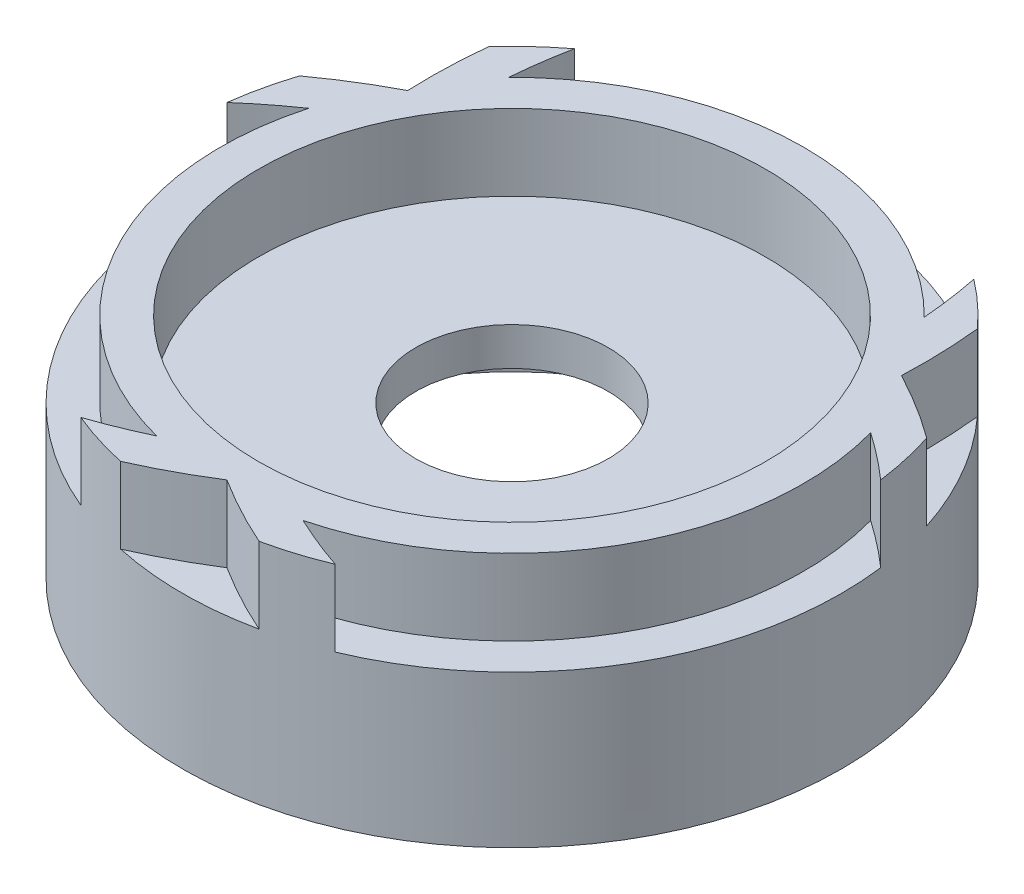
ISO-10303-21;
HEADER;
FILE_DESCRIPTION(('STEP AP214'),'2;1');
FILE_NAME('part.step','',(''),(''),'','','');
FILE_SCHEMA(('AUTOMOTIVE_DESIGN { 1 0 10303 214 1 1 1 1 }'));
ENDSEC;
DATA;
#1=APPLICATION_CONTEXT('core data for automotive mechanical design processes');
#2=APPLICATION_PROTOCOL_DEFINITION('international standard','automotive_design',2000,#1);
#3=PRODUCT_CONTEXT('',#1,'mechanical');
#4=PRODUCT('Part','Part','',(#3));
#5=PRODUCT_RELATED_PRODUCT_CATEGORY('part','',(#4));
#6=PRODUCT_DEFINITION_FORMATION('','',#4);
#7=PRODUCT_DEFINITION_CONTEXT('part definition',#1,'design');
#8=PRODUCT_DEFINITION('design','',#6,#7);
#9=PRODUCT_DEFINITION_SHAPE('','',#8);
#10=(LENGTH_UNIT() NAMED_UNIT(*) SI_UNIT(.MILLI.,.METRE.));
#11=(NAMED_UNIT(*) PLANE_ANGLE_UNIT() SI_UNIT($,.RADIAN.));
#12=(NAMED_UNIT(*) SI_UNIT($,.STERADIAN.) SOLID_ANGLE_UNIT());
#13=UNCERTAINTY_MEASURE_WITH_UNIT(LENGTH_MEASURE(1.E-05),#10,'distance_accuracy_value','');
#14=(GEOMETRIC_REPRESENTATION_CONTEXT(3) GLOBAL_UNCERTAINTY_ASSIGNED_CONTEXT((#13)) GLOBAL_UNIT_ASSIGNED_CONTEXT((#10,
#11,#12)) REPRESENTATION_CONTEXT('',''));
#15=CARTESIAN_POINT('',(0.,0.,0.));
#16=DIRECTION('',(0.,0.,1.));
#17=DIRECTION('',(1.,0.,0.));
#18=AXIS2_PLACEMENT_3D('',#15,#16,#17);
#19=CARTESIAN_POINT('',(0.,-3.,0.));
#20=DIRECTION('',(0.,-1.,0.));
#21=DIRECTION('',(0.,0.,-1.));
#22=AXIS2_PLACEMENT_3D('',#19,#20,#21);
#23=PLANE('',#22);
#24=CARTESIAN_POINT('',(0.,-3.,-63.0940107675848));
#25=DIRECTION('',(0.,-1.,0.));
#26=DIRECTION('',(0.,0.,-1.));
#27=AXIS2_PLACEMENT_3D('',#24,#25,#26);
#28=CIRCLE('',#27,10.);
#29=CARTESIAN_POINT('',(0.,-3.,-73.0940107675848));
#30=VERTEX_POINT('',#29);
#31=EDGE_CURVE('E326',#30,#30,#28,.T.);
#32=ORIENTED_EDGE('',*,*,#31,.F.);
#33=EDGE_LOOP('',(#32));
#34=FACE_BOUND('',#33,.T.);
#35=CARTESIAN_POINT('',(0.,-3.,-63.0940107675848));
#36=DIRECTION('',(0.,-1.,0.));
#37=DIRECTION('',(0.,0.,-1.));
#38=AXIS2_PLACEMENT_3D('',#35,#36,#37);
#39=CIRCLE('',#38,13.);
#40=CARTESIAN_POINT('',(0.,-3.,-76.0940107675848));
#41=VERTEX_POINT('',#40);
#42=EDGE_CURVE('E51',#41,#41,#39,.F.);
#43=ORIENTED_EDGE('',*,*,#42,.F.);
#44=EDGE_LOOP('',(#43));
#45=FACE_BOUND('',#44,.T.);
#46=ADVANCED_FACE('F47',(#34,#45),#23,.T.);
#47=CARTESIAN_POINT('',(0.,-10.7480230740358,-63.0940107675848));
#48=DIRECTION('',(0.,1.,0.));
#49=DIRECTION('',(0.,0.,1.));
#50=AXIS2_PLACEMENT_3D('',#47,#48,#49);
#51=CYLINDRICAL_SURFACE('',#50,3.80000000000009);
#52=CARTESIAN_POINT('',(0.,3.,-63.0940107675848));
#53=DIRECTION('',(0.,1.,0.));
#54=DIRECTION('',(0.,0.,1.));
#55=AXIS2_PLACEMENT_3D('',#52,#53,#54);
#56=CIRCLE('',#55,3.80000000000009);
#57=CARTESIAN_POINT('',(0.,3.,-59.2940107675847));
#58=VERTEX_POINT('',#57);
#59=EDGE_CURVE('E321',#58,#58,#56,.T.);
#60=CARTESIAN_POINT('',(0.,1.5,-63.0940107675848));
#61=DIRECTION('',(0.,-1.,0.));
#62=DIRECTION('',(0.,0.,-1.));
#63=AXIS2_PLACEMENT_3D('',#60,#61,#62);
#64=CIRCLE('',#63,3.80000000000009);
#65=CARTESIAN_POINT('',(0.,1.5,-59.2940107675847));
#66=VERTEX_POINT('',#65);
#67=EDGE_CURVE('E323',#66,#66,#64,.F.);
#68=CARTESIAN_POINT('',(0.,3.,-59.2940107675847));
#69=CARTESIAN_POINT('',(0.,2.984375,-59.2940107675847));
#70=CARTESIAN_POINT('',(0.,2.96875,-59.2940107675847));
#71=CARTESIAN_POINT('',(0.,2.9375,-59.2940107675847));
#72=CARTESIAN_POINT('',(0.,2.921875,-59.2940107675847));
#73=CARTESIAN_POINT('',(0.,2.890625,-59.2940107675847));
#74=CARTESIAN_POINT('',(0.,2.875,-59.2940107675847));
#75=CARTESIAN_POINT('',(0.,2.84375,-59.2940107675847));
#76=CARTESIAN_POINT('',(0.,2.828125,-59.2940107675847));
#77=CARTESIAN_POINT('',(0.,2.796875,-59.2940107675847));
#78=CARTESIAN_POINT('',(0.,2.78125,-59.2940107675847));
#79=CARTESIAN_POINT('',(0.,2.75,-59.2940107675847));
#80=CARTESIAN_POINT('',(0.,2.734375,-59.2940107675847));
#81=CARTESIAN_POINT('',(0.,2.703125,-59.2940107675847));
#82=CARTESIAN_POINT('',(0.,2.6875,-59.2940107675847));
#83=CARTESIAN_POINT('',(0.,2.65625,-59.2940107675847));
#84=CARTESIAN_POINT('',(0.,2.640625,-59.2940107675847));
#85=CARTESIAN_POINT('',(0.,2.609375,-59.2940107675847));
#86=CARTESIAN_POINT('',(0.,2.59375,-59.2940107675847));
#87=CARTESIAN_POINT('',(0.,2.5625,-59.2940107675847));
#88=CARTESIAN_POINT('',(0.,2.546875,-59.2940107675847));
#89=CARTESIAN_POINT('',(0.,2.515625,-59.2940107675847));
#90=CARTESIAN_POINT('',(0.,2.5,-59.2940107675847));
#91=CARTESIAN_POINT('',(0.,2.46875,-59.2940107675847));
#92=CARTESIAN_POINT('',(0.,2.453125,-59.2940107675847));
#93=CARTESIAN_POINT('',(0.,2.421875,-59.2940107675847));
#94=CARTESIAN_POINT('',(0.,2.40625,-59.2940107675847));
#95=CARTESIAN_POINT('',(0.,2.375,-59.2940107675847));
#96=CARTESIAN_POINT('',(0.,2.359375,-59.2940107675847));
#97=CARTESIAN_POINT('',(0.,2.328125,-59.2940107675847));
#98=CARTESIAN_POINT('',(0.,2.3125,-59.2940107675847));
#99=CARTESIAN_POINT('',(0.,2.28125,-59.2940107675847));
#100=CARTESIAN_POINT('',(0.,2.265625,-59.2940107675847));
#101=CARTESIAN_POINT('',(0.,2.234375,-59.2940107675847));
#102=CARTESIAN_POINT('',(0.,2.21875,-59.2940107675847));
#103=CARTESIAN_POINT('',(0.,2.1875,-59.2940107675847));
#104=CARTESIAN_POINT('',(0.,2.171875,-59.2940107675847));
#105=CARTESIAN_POINT('',(0.,2.140625,-59.2940107675847));
#106=CARTESIAN_POINT('',(0.,2.125,-59.2940107675847));
#107=CARTESIAN_POINT('',(0.,2.09375,-59.2940107675847));
#108=CARTESIAN_POINT('',(0.,2.078125,-59.2940107675847));
#109=CARTESIAN_POINT('',(0.,2.046875,-59.2940107675847));
#110=CARTESIAN_POINT('',(0.,2.03125,-59.2940107675847));
#111=CARTESIAN_POINT('',(0.,2.,-59.2940107675847));
#112=CARTESIAN_POINT('',(0.,1.984375,-59.2940107675847));
#113=CARTESIAN_POINT('',(0.,1.953125,-59.2940107675847));
#114=CARTESIAN_POINT('',(0.,1.9375,-59.2940107675847));
#115=CARTESIAN_POINT('',(0.,1.90625,-59.2940107675847));
#116=CARTESIAN_POINT('',(0.,1.890625,-59.2940107675847));
#117=CARTESIAN_POINT('',(0.,1.859375,-59.2940107675847));
#118=CARTESIAN_POINT('',(0.,1.84375,-59.2940107675847));
#119=CARTESIAN_POINT('',(0.,1.8125,-59.2940107675847));
#120=CARTESIAN_POINT('',(0.,1.796875,-59.2940107675847));
#121=CARTESIAN_POINT('',(0.,1.765625,-59.2940107675847));
#122=CARTESIAN_POINT('',(0.,1.75,-59.2940107675847));
#123=CARTESIAN_POINT('',(0.,1.71875,-59.2940107675847));
#124=CARTESIAN_POINT('',(0.,1.703125,-59.2940107675847));
#125=CARTESIAN_POINT('',(0.,1.671875,-59.2940107675847));
#126=CARTESIAN_POINT('',(0.,1.65625,-59.2940107675847));
#127=CARTESIAN_POINT('',(0.,1.625,-59.2940107675847));
#128=CARTESIAN_POINT('',(0.,1.609375,-59.2940107675847));
#129=CARTESIAN_POINT('',(0.,1.578125,-59.2940107675847));
#130=CARTESIAN_POINT('',(0.,1.5625,-59.2940107675847));
#131=CARTESIAN_POINT('',(0.,1.53125,-59.2940107675847));
#132=CARTESIAN_POINT('',(0.,1.515625,-59.2940107675847));
#133=CARTESIAN_POINT('',(0.,1.5,-59.2940107675847));
#134=B_SPLINE_CURVE_WITH_KNOTS('',3,(#68,#69,#70,#71,#72,#73,#74,#75,#76,#77,#78,#79,#80,#81,
#82,#83,#84,#85,#86,#87,#88,#89,#90,#91,#92,#93,#94,#95,#96,#97,#98,#99,#100,#101,#102,#103,
#104,#105,#106,#107,#108,#109,#110,#111,#112,#113,#114,#115,#116,#117,#118,#119,#120,#121,#122,
#123,#124,#125,#126,#127,#128,#129,#130,#131,#132,#133),.UNSPECIFIED.,.F.,.F.,(4,2,2,2,2,2,2,2,
2,2,2,2,2,2,2,2,2,2,2,2,2,2,2,2,2,2,2,2,2,2,2,2,4),(0.,0.046875,0.0937500000000001,0.140625,
0.1875,0.234375,0.28125,0.328125,0.375,0.421875,0.46875,0.515625,0.5625,0.609375000000001,
0.656250000000001,0.703125000000001,0.750000000000001,0.796875000000001,0.843750000000001,
0.890625000000001,0.937500000000001,0.984375000000001,1.03125,1.078125,1.125,1.171875,1.21875,
1.265625,1.3125,1.359375,1.40625,1.453125,1.5),.UNSPECIFIED.);
#135=EDGE_CURVE('BSEAM337',#58,#66,#134,.T.);
#136=ORIENTED_EDGE('',*,*,#59,.T.);
#137=ORIENTED_EDGE('',*,*,#67,.F.);
#138=ORIENTED_EDGE('',*,*,#135,.T.);
#139=ORIENTED_EDGE('',*,*,#135,.F.);
#140=EDGE_LOOP('',(#136,#138,#137,#139));
#141=FACE_BOUND('',#140,.T.);
#142=ADVANCED_FACE('F337',(#141),#51,.F.);
#143=CARTESIAN_POINT('',(0.,1.5,-63.0940107675848));
#144=DIRECTION('',(0.,-1.,0.));
#145=DIRECTION('',(0.,0.,-1.));
#146=AXIS2_PLACEMENT_3D('',#143,#144,#145);
#147=PLANE('',#146);
#148=CARTESIAN_POINT('',(0.,1.5,-63.0940107675848));
#149=DIRECTION('',(0.,-1.,0.));
#150=DIRECTION('',(0.,0.,-1.));
#151=AXIS2_PLACEMENT_3D('',#148,#149,#150);
#152=CIRCLE('',#151,6.30000000000009);
#153=CARTESIAN_POINT('',(0.,1.5,-69.3940107675849));
#154=VERTEX_POINT('',#153);
#155=EDGE_CURVE('E56',#154,#154,#152,.T.);
#156=ORIENTED_EDGE('',*,*,#155,.T.);
#157=EDGE_LOOP('',(#156));
#158=FACE_BOUND('',#157,.T.);
#159=ORIENTED_EDGE('',*,*,#67,.T.);
#160=EDGE_LOOP('',(#159));
#161=FACE_BOUND('',#160,.T.);
#162=ADVANCED_FACE('F343',(#158,#161),#147,.T.);
#163=CARTESIAN_POINT('',(0.,1.5,-63.0940107675848));
#164=DIRECTION('',(0.,-1.,0.));
#165=DIRECTION('',(0.,0.,-1.));
#166=AXIS2_PLACEMENT_3D('',#163,#164,#165);
#167=CYLINDRICAL_SURFACE('',#166,6.30000000000009);
#168=ORIENTED_EDGE('',*,*,#155,.F.);
#169=EDGE_LOOP('',(#168));
#170=FACE_BOUND('',#169,.T.);
#171=CARTESIAN_POINT('',(0.,0.,-63.0940107675848));
#172=DIRECTION('',(0.,-1.,0.));
#173=DIRECTION('',(0.,0.,-1.));
#174=AXIS2_PLACEMENT_3D('',#171,#172,#173);
#175=CIRCLE('',#174,6.30000000000009);
#176=CARTESIAN_POINT('',(0.,0.,-69.3940107675849));
#177=VERTEX_POINT('',#176);
#178=EDGE_CURVE('E11',#177,#177,#175,.T.);
#179=ORIENTED_EDGE('',*,*,#178,.T.);
#180=EDGE_LOOP('',(#179));
#181=FACE_BOUND('',#180,.T.);
#182=ADVANCED_FACE('F394',(#170,#181),#167,.F.);
#183=CARTESIAN_POINT('',(0.,0.,0.));
#184=DIRECTION('',(0.,1.,0.));
#185=DIRECTION('',(0.,0.,1.));
#186=AXIS2_PLACEMENT_3D('',#183,#184,#185);
#187=PLANE('',#186);
#188=ORIENTED_EDGE('',*,*,#178,.F.);
#189=EDGE_LOOP('',(#188));
#190=FACE_BOUND('',#189,.T.);
#191=CARTESIAN_POINT('',(0.,0.,-63.0940107675848));
#192=DIRECTION('',(0.,1.,0.));
#193=DIRECTION('',(0.,0.,1.));
#194=AXIS2_PLACEMENT_3D('',#191,#192,#193);
#195=CIRCLE('',#194,10.);
#196=CARTESIAN_POINT('',(0.,0.,-53.0940107675848));
#197=VERTEX_POINT('',#196);
#198=EDGE_CURVE('E264',#197,#197,#195,.F.);
#199=ORIENTED_EDGE('',*,*,#198,.T.);
#200=EDGE_LOOP('',(#199));
#201=FACE_BOUND('',#200,.T.);
#202=ADVANCED_FACE('F399',(#190,#201),#187,.F.);
#203=CARTESIAN_POINT('',(0.,-9.,-63.0940107675848));
#204=DIRECTION('',(0.,1.,0.));
#205=DIRECTION('',(0.,0.,1.));
#206=AXIS2_PLACEMENT_3D('',#203,#204,#205);
#207=CYLINDRICAL_SURFACE('',#206,10.);
#208=ORIENTED_EDGE('',*,*,#198,.F.);
#209=EDGE_LOOP('',(#208));
#210=FACE_BOUND('',#209,.T.);
#211=ORIENTED_EDGE('',*,*,#31,.T.);
#212=EDGE_LOOP('',(#211));
#213=FACE_BOUND('',#212,.T.);
#214=ADVANCED_FACE('F405',(#210,#213),#207,.F.);
#215=CARTESIAN_POINT('',(0.,3.,0.));
#216=DIRECTION('',(0.,1.,0.));
#217=DIRECTION('',(0.,0.,1.));
#218=AXIS2_PLACEMENT_3D('',#215,#216,#217);
#219=PLANE('',#218);
#220=ORIENTED_EDGE('',*,*,#59,.F.);
#221=EDGE_LOOP('',(#220));
#222=FACE_BOUND('',#221,.T.);
#223=CARTESIAN_POINT('',(0.,3.,-63.0940107675848));
#224=DIRECTION('',(0.,1.,0.));
#225=DIRECTION('',(0.,0.,1.));
#226=AXIS2_PLACEMENT_3D('',#223,#224,#225);
#227=CIRCLE('',#226,10.);
#228=CARTESIAN_POINT('',(0.,3.,-53.0940107675848));
#229=VERTEX_POINT('',#228);
#230=EDGE_CURVE('E285',#229,#229,#227,.T.);
#231=ORIENTED_EDGE('',*,*,#230,.T.);
#232=EDGE_LOOP('',(#231));
#233=FACE_BOUND('',#232,.T.);
#234=ADVANCED_FACE('F407',(#222,#233),#219,.T.);
#235=CARTESIAN_POINT('',(0.,6.,-63.0940107675848));
#236=DIRECTION('',(0.,-1.,0.));
#237=DIRECTION('',(0.,0.,-1.));
#238=AXIS2_PLACEMENT_3D('',#235,#236,#237);
#239=CYLINDRICAL_SURFACE('',#238,11.4999999999999);
#240=DIRECTION('',(0.,-1.,0.));
#241=VECTOR('',#240,1.);
#242=CARTESIAN_POINT('',(-2.88919192501458,4.5,-51.9628576368248));
#243=LINE('',#242,#241);
#244=CARTESIAN_POINT('',(-2.88919192501458,6.,-51.9628576368248));
#245=VERTEX_POINT('',#244);
#246=CARTESIAN_POINT('',(-2.88919192501458,3.,-51.9628576368248));
#247=VERTEX_POINT('',#246);
#248=EDGE_CURVE('E296',#245,#247,#243,.T.);
#249=ORIENTED_EDGE('',*,*,#248,.F.);
#250=CARTESIAN_POINT('',(0.,6.,-63.0940107675848));
#251=DIRECTION('',(0.,1.,0.));
#252=DIRECTION('',(0.,0.,1.));
#253=AXIS2_PLACEMENT_3D('',#250,#251,#252);
#254=CIRCLE('',#253,11.4999999999999);
#255=CARTESIAN_POINT('',(-11.0844573471601,6.,-66.1574737294938));
#256=VERTEX_POINT('',#255);
#257=EDGE_CURVE('E291',#256,#245,#254,.T.);
#258=ORIENTED_EDGE('',*,*,#257,.F.);
#259=DIRECTION('',(0.,-1.,0.));
#260=VECTOR('',#259,1.);
#261=CARTESIAN_POINT('',(-11.0844573471601,4.5,-66.1574737294938));
#262=LINE('',#261,#260);
#263=CARTESIAN_POINT('',(-11.0844573471601,3.,-66.1574737294938));
#264=VERTEX_POINT('',#263);
#265=EDGE_CURVE('E294',#264,#256,#262,.F.);
#266=ORIENTED_EDGE('',*,*,#265,.F.);
#267=CARTESIAN_POINT('',(0.,3.,-63.0940107675848));
#268=DIRECTION('',(0.,1.,0.));
#269=DIRECTION('',(0.,0.,1.));
#270=AXIS2_PLACEMENT_3D('',#267,#268,#269);
#271=CIRCLE('',#270,11.4999999999999);
#272=EDGE_CURVE('E214',#247,#264,#271,.F.);
#273=ORIENTED_EDGE('',*,*,#272,.F.);
#274=EDGE_LOOP('',(#249,#258,#266,#273));
#275=FACE_BOUND('',#274,.T.);
#276=ADVANCED_FACE('F410',(#275),#239,.T.);
#277=CARTESIAN_POINT('',(0.,6.,-63.0940107675848));
#278=DIRECTION('',(0.,-1.,0.));
#279=DIRECTION('',(0.,0.,-1.));
#280=AXIS2_PLACEMENT_3D('',#277,#278,#279);
#281=CYLINDRICAL_SURFACE('',#280,11.5000000000001);
#282=DIRECTION('',(0.,-1.,0.));
#283=VECTOR('',#282,1.);
#284=CARTESIAN_POINT('',(8.19526542214578,4.5,-71.1617009364363));
#285=LINE('',#284,#283);
#286=CARTESIAN_POINT('',(8.19526542214578,3.,-71.1617009364363));
#287=VERTEX_POINT('',#286);
#288=CARTESIAN_POINT('',(8.19526542214578,6.,-71.1617009364363));
#289=VERTEX_POINT('',#288);
#290=EDGE_CURVE('E302',#287,#289,#285,.F.);
#291=ORIENTED_EDGE('',*,*,#290,.F.);
#292=CARTESIAN_POINT('',(0.,3.,-63.0940107675848));
#293=DIRECTION('',(0.,1.,0.));
#294=DIRECTION('',(0.,0.,1.));
#295=AXIS2_PLACEMENT_3D('',#292,#293,#294);
#296=CIRCLE('',#295,11.5000000000001);
#297=CARTESIAN_POINT('',(-8.19526542214581,3.,-71.1617009364364));
#298=VERTEX_POINT('',#297);
#299=EDGE_CURVE('E314',#298,#287,#296,.F.);
#300=ORIENTED_EDGE('',*,*,#299,.F.);
#301=DIRECTION('',(0.,-1.,0.));
#302=VECTOR('',#301,1.);
#303=CARTESIAN_POINT('',(-8.19526542214581,4.5,-71.1617009364364));
#304=LINE('',#303,#302);
#305=CARTESIAN_POINT('',(-8.19526542214581,6.,-71.1617009364364));
#306=VERTEX_POINT('',#305);
#307=EDGE_CURVE('E299',#306,#298,#304,.T.);
#308=ORIENTED_EDGE('',*,*,#307,.F.);
#309=CARTESIAN_POINT('',(0.,6.,-63.0940107675848));
#310=DIRECTION('',(0.,1.,0.));
#311=DIRECTION('',(0.,0.,1.));
#312=AXIS2_PLACEMENT_3D('',#309,#310,#311);
#313=CIRCLE('',#312,11.5000000000001);
#314=EDGE_CURVE('E288',#289,#306,#313,.T.);
#315=ORIENTED_EDGE('',*,*,#314,.F.);
#316=EDGE_LOOP('',(#291,#300,#308,#315));
#317=FACE_BOUND('',#316,.T.);
#318=ADVANCED_FACE('F416',(#317),#281,.T.);
#319=CARTESIAN_POINT('',(0.,6.,-63.0940107675848));
#320=DIRECTION('',(0.,-1.,0.));
#321=DIRECTION('',(0.,0.,-1.));
#322=AXIS2_PLACEMENT_3D('',#319,#320,#321);
#323=CYLINDRICAL_SURFACE('',#322,11.5);
#324=DIRECTION('',(0.,-1.,0.));
#325=VECTOR('',#324,1.);
#326=CARTESIAN_POINT('',(2.88919192501457,4.5,-51.9628576368248));
#327=LINE('',#326,#325);
#328=CARTESIAN_POINT('',(2.88919192501457,3.,-51.9628576368248));
#329=VERTEX_POINT('',#328);
#330=CARTESIAN_POINT('',(2.88919192501458,6.,-51.9628576368248));
#331=VERTEX_POINT('',#330);
#332=EDGE_CURVE('E307',#329,#331,#327,.F.);
#333=ORIENTED_EDGE('',*,*,#332,.F.);
#334=CARTESIAN_POINT('',(0.,3.,-63.0940107675848));
#335=DIRECTION('',(0.,1.,0.));
#336=DIRECTION('',(0.,0.,1.));
#337=AXIS2_PLACEMENT_3D('',#334,#335,#336);
#338=CIRCLE('',#337,11.5);
#339=CARTESIAN_POINT('',(11.08445734716,3.,-66.1574737294939));
#340=VERTEX_POINT('',#339);
#341=EDGE_CURVE('E316',#340,#329,#338,.F.);
#342=ORIENTED_EDGE('',*,*,#341,.F.);
#343=DIRECTION('',(0.,-1.,0.));
#344=VECTOR('',#343,1.);
#345=CARTESIAN_POINT('',(11.08445734716,4.5,-66.1574737294939));
#346=LINE('',#345,#344);
#347=CARTESIAN_POINT('',(11.08445734716,6.,-66.1574737294939));
#348=VERTEX_POINT('',#347);
#349=EDGE_CURVE('E304',#348,#340,#346,.T.);
#350=ORIENTED_EDGE('',*,*,#349,.F.);
#351=CARTESIAN_POINT('',(0.,6.,-63.0940107675848));
#352=DIRECTION('',(0.,1.,0.));
#353=DIRECTION('',(0.,0.,1.));
#354=AXIS2_PLACEMENT_3D('',#351,#352,#353);
#355=CIRCLE('',#354,11.5);
#356=EDGE_CURVE('E284',#331,#348,#355,.T.);
#357=ORIENTED_EDGE('',*,*,#356,.F.);
#358=EDGE_LOOP('',(#333,#342,#350,#357));
#359=FACE_BOUND('',#358,.T.);
#360=ADVANCED_FACE('F412',(#359),#323,.T.);
#361=CARTESIAN_POINT('',(0.,6.,-63.0940107675848));
#362=DIRECTION('',(0.,-1.,0.));
#363=DIRECTION('',(0.,0.,-1.));
#364=AXIS2_PLACEMENT_3D('',#361,#362,#363);
#365=CYLINDRICAL_SURFACE('',#364,10.);
#366=ORIENTED_EDGE('',*,*,#230,.F.);
#367=EDGE_LOOP('',(#366));
#368=FACE_BOUND('',#367,.T.);
#369=CARTESIAN_POINT('',(0.,6.,-63.0940107675848));
#370=DIRECTION('',(0.,1.,0.));
#371=DIRECTION('',(0.,0.,1.));
#372=AXIS2_PLACEMENT_3D('',#369,#370,#371);
#373=CIRCLE('',#372,10.);
#374=CARTESIAN_POINT('',(0.,6.,-53.0940107675848));
#375=VERTEX_POINT('',#374);
#376=EDGE_CURVE('E281',#375,#375,#373,.T.);
#377=ORIENTED_EDGE('',*,*,#376,.T.);
#378=EDGE_LOOP('',(#377));
#379=FACE_BOUND('',#378,.T.);
#380=ADVANCED_FACE('F415',(#368,#379),#365,.F.);
#381=CARTESIAN_POINT('',(11.2583302491977,6.,-69.594010767585));
#382=DIRECTION('',(0.,-1.,0.));
#383=DIRECTION('',(0.,0.,-1.));
#384=AXIS2_PLACEMENT_3D('',#381,#382,#383);
#385=CYLINDRICAL_SURFACE('',#384,19.5166604983954);
#386=CARTESIAN_POINT('',(11.2583302491977,6.,-69.594010767585));
#387=DIRECTION('',(0.,1.,0.));
#388=DIRECTION('',(0.,0.,1.));
#389=AXIS2_PLACEMENT_3D('',#386,#387,#388);
#390=CIRCLE('',#389,19.5166604983954);
#391=CARTESIAN_POINT('',(5.01848841913951,6.,-51.1017310015453));
#392=VERTEX_POINT('',#391);
#393=EDGE_CURVE('E235',#331,#392,#390,.T.);
#394=ORIENTED_EDGE('',*,*,#393,.T.);
#395=DIRECTION('',(0.,1.,0.));
#396=VECTOR('',#395,1.);
#397=CARTESIAN_POINT('',(5.01848841913951,-3.005,-51.1017310015453));
#398=LINE('',#397,#396);
#399=CARTESIAN_POINT('',(5.01848841913951,3.,-51.1017310015453));
#400=VERTEX_POINT('',#399);
#401=EDGE_CURVE('E363',#392,#400,#398,.F.);
#402=ORIENTED_EDGE('',*,*,#401,.T.);
#403=CARTESIAN_POINT('',(11.2583302491977,3.,-69.594010767585));
#404=DIRECTION('',(0.,1.,0.));
#405=DIRECTION('',(0.,0.,1.));
#406=AXIS2_PLACEMENT_3D('',#403,#404,#405);
#407=CIRCLE('',#406,19.5166604983954);
#408=EDGE_CURVE('E242',#329,#400,#407,.T.);
#409=ORIENTED_EDGE('',*,*,#408,.F.);
#410=ORIENTED_EDGE('',*,*,#332,.T.);
#411=EDGE_LOOP('',(#394,#402,#409,#410));
#412=FACE_BOUND('',#411,.T.);
#413=ADVANCED_FACE('F426',(#412),#385,.F.);
#414=CARTESIAN_POINT('',(0.,3.,0.));
#415=DIRECTION('',(0.,1.,0.));
#416=DIRECTION('',(0.,0.,1.));
#417=AXIS2_PLACEMENT_3D('',#414,#415,#416);
#418=PLANE('',#417);
#419=ORIENTED_EDGE('',*,*,#408,.T.);
#420=CARTESIAN_POINT('',(0.,3.,-63.0940107675848));
#421=DIRECTION('',(0.,1.,0.));
#422=DIRECTION('',(0.,0.,1.));
#423=AXIS2_PLACEMENT_3D('',#420,#421,#422);
#424=CIRCLE('',#423,13.);
#425=CARTESIAN_POINT('',(12.89486313625,3.,-64.7440121910323));
#426=VERTEX_POINT('',#425);
#427=EDGE_CURVE('E318',#400,#426,#424,.T.);
#428=ORIENTED_EDGE('',*,*,#427,.T.);
#429=CARTESIAN_POINT('',(0.,3.,-50.094010767585));
#430=DIRECTION('',(0.,1.,0.));
#431=DIRECTION('',(0.,0.,1.));
#432=AXIS2_PLACEMENT_3D('',#429,#430,#431);
#433=CIRCLE('',#432,19.5166604983954);
#434=EDGE_CURVE('E239',#426,#340,#433,.T.);
#435=ORIENTED_EDGE('',*,*,#434,.T.);
#436=ORIENTED_EDGE('',*,*,#341,.T.);
#437=EDGE_LOOP('',(#419,#428,#435,#436));
#438=FACE_BOUND('',#437,.T.);
#439=ADVANCED_FACE('F448',(#438),#418,.T.);
#440=CARTESIAN_POINT('',(0.,6.,-50.094010767585));
#441=DIRECTION('',(0.,-1.,0.));
#442=DIRECTION('',(0.,0.,-1.));
#443=AXIS2_PLACEMENT_3D('',#440,#441,#442);
#444=CYLINDRICAL_SURFACE('',#443,19.5166604983954);
#445=ORIENTED_EDGE('',*,*,#434,.F.);
#446=DIRECTION('',(0.,1.,0.));
#447=VECTOR('',#446,1.);
#448=CARTESIAN_POINT('',(12.89486313625,-3.005,-64.7440121910323));
#449=LINE('',#448,#447);
#450=CARTESIAN_POINT('',(12.89486313625,6.,-64.7440121910323));
#451=VERTEX_POINT('',#450);
#452=EDGE_CURVE('E272',#426,#451,#449,.T.);
#453=ORIENTED_EDGE('',*,*,#452,.T.);
#454=CARTESIAN_POINT('',(0.,6.,-50.094010767585));
#455=DIRECTION('',(0.,1.,0.));
#456=DIRECTION('',(0.,0.,1.));
#457=AXIS2_PLACEMENT_3D('',#454,#455,#456);
#458=CIRCLE('',#457,19.5166604983954);
#459=EDGE_CURVE('E232',#451,#348,#458,.T.);
#460=ORIENTED_EDGE('',*,*,#459,.T.);
#461=ORIENTED_EDGE('',*,*,#349,.T.);
#462=EDGE_LOOP('',(#445,#453,#460,#461));
#463=FACE_BOUND('',#462,.T.);
#464=ADVANCED_FACE('F450',(#463),#444,.F.);
#465=CARTESIAN_POINT('',(0.,6.,-50.094010767585));
#466=DIRECTION('',(0.,-1.,0.));
#467=DIRECTION('',(0.,0.,-1.));
#468=AXIS2_PLACEMENT_3D('',#465,#466,#467);
#469=CYLINDRICAL_SURFACE('',#468,21.0166604983954);
#470=DIRECTION('',(0.,1.,0.));
#471=VECTOR('',#470,1.);
#472=CARTESIAN_POINT('',(12.373042022027,-3.005,-67.0824730177702));
#473=LINE('',#472,#471);
#474=CARTESIAN_POINT('',(12.373042022027,3.,-67.0824730177702));
#475=VERTEX_POINT('',#474);
#476=CARTESIAN_POINT('',(12.373042022027,6.,-67.0824730177702));
#477=VERTEX_POINT('',#476);
#478=EDGE_CURVE('E268',#475,#477,#473,.T.);
#479=ORIENTED_EDGE('',*,*,#478,.F.);
#480=CARTESIAN_POINT('',(0.,3.,-50.094010767585));
#481=DIRECTION('',(0.,1.,0.));
#482=DIRECTION('',(0.,0.,1.));
#483=AXIS2_PLACEMENT_3D('',#480,#481,#482);
#484=CIRCLE('',#483,21.0166604983954);
#485=CARTESIAN_POINT('',(9.74004155234482,3.,-68.7174263797495));
#486=VERTEX_POINT('',#485);
#487=EDGE_CURVE('E227',#475,#486,#484,.T.);
#488=ORIENTED_EDGE('',*,*,#487,.T.);
#489=DIRECTION('',(0.,-1.,0.));
#490=VECTOR('',#489,1.);
#491=CARTESIAN_POINT('',(9.74004155234482,6.,-68.7174263797495));
#492=LINE('',#491,#490);
#493=CARTESIAN_POINT('',(9.74004155234482,6.,-68.7174263797495));
#494=VERTEX_POINT('',#493);
#495=EDGE_CURVE('E215',#494,#486,#492,.T.);
#496=ORIENTED_EDGE('',*,*,#495,.F.);
#497=CARTESIAN_POINT('',(0.,6.,-50.094010767585));
#498=DIRECTION('',(0.,1.,0.));
#499=DIRECTION('',(0.,0.,1.));
#500=AXIS2_PLACEMENT_3D('',#497,#498,#499);
#501=CIRCLE('',#500,21.0166604983954);
#502=EDGE_CURVE('E221',#477,#494,#501,.T.);
#503=ORIENTED_EDGE('',*,*,#502,.F.);
#504=EDGE_LOOP('',(#479,#488,#496,#503));
#505=FACE_BOUND('',#504,.T.);
#506=ADVANCED_FACE('F452',(#505),#469,.T.);
#507=ORIENTED_EDGE('',*,*,#487,.F.);
#508=CARTESIAN_POINT('',(0.,3.,-63.0940107675848));
#509=DIRECTION('',(0.,1.,0.));
#510=DIRECTION('',(0.,0.,1.));
#511=AXIS2_PLACEMENT_3D('',#508,#509,#510);
#512=CIRCLE('',#511,13.);
#513=CARTESIAN_POINT('',(9.64063064170913,3.,-71.81514835566));
#514=VERTEX_POINT('',#513);
#515=EDGE_CURVE('E280',#475,#514,#512,.T.);
#516=ORIENTED_EDGE('',*,*,#515,.T.);
#517=CARTESIAN_POINT('',(-11.2583302491977,3.,-69.594010767585));
#518=DIRECTION('',(0.,1.,0.));
#519=DIRECTION('',(0.,0.,1.));
#520=AXIS2_PLACEMENT_3D('',#517,#518,#519);
#521=CIRCLE('',#520,21.0166604983954);
#522=EDGE_CURVE('E229',#486,#514,#521,.T.);
#523=ORIENTED_EDGE('',*,*,#522,.F.);
#524=EDGE_LOOP('',(#507,#516,#523));
#525=FACE_BOUND('',#524,.T.);
#526=ADVANCED_FACE('F441',(#525),#418,.T.);
#527=CARTESIAN_POINT('',(-11.2583302491977,6.,-69.594010767585));
#528=DIRECTION('',(0.,-1.,0.));
#529=DIRECTION('',(0.,0.,-1.));
#530=AXIS2_PLACEMENT_3D('',#527,#528,#529);
#531=CYLINDRICAL_SURFACE('',#530,21.0166604983954);
#532=DIRECTION('',(0.,1.,0.));
#533=VECTOR('',#532,1.);
#534=CARTESIAN_POINT('',(9.64063064170914,-3.005,-71.81514835566));
#535=LINE('',#534,#533);
#536=CARTESIAN_POINT('',(9.64063064170913,6.,-71.81514835566));
#537=VERTEX_POINT('',#536);
#538=EDGE_CURVE('E265',#537,#514,#535,.F.);
#539=ORIENTED_EDGE('',*,*,#538,.F.);
#540=CARTESIAN_POINT('',(-11.2583302491977,6.,-69.594010767585));
#541=DIRECTION('',(0.,1.,0.));
#542=DIRECTION('',(0.,0.,1.));
#543=AXIS2_PLACEMENT_3D('',#540,#541,#542);
#544=CIRCLE('',#543,21.0166604983954);
#545=EDGE_CURVE('E223',#494,#537,#544,.T.);
#546=ORIENTED_EDGE('',*,*,#545,.F.);
#547=ORIENTED_EDGE('',*,*,#495,.T.);
#548=ORIENTED_EDGE('',*,*,#522,.T.);
#549=EDGE_LOOP('',(#539,#546,#547,#548));
#550=FACE_BOUND('',#549,.T.);
#551=ADVANCED_FACE('F432',(#550),#531,.T.);
#552=CARTESIAN_POINT('',(-11.2583302491977,6.,-69.594010767585));
#553=DIRECTION('',(0.,-1.,0.));
#554=DIRECTION('',(0.,0.,-1.));
#555=AXIS2_PLACEMENT_3D('',#552,#553,#554);
#556=CYLINDRICAL_SURFACE('',#555,19.5166604983954);
#557=CARTESIAN_POINT('',(-11.2583302491977,6.,-69.594010767585));
#558=DIRECTION('',(0.,1.,0.));
#559=DIRECTION('',(0.,0.,1.));
#560=AXIS2_PLACEMENT_3D('',#557,#558,#559);
#561=CIRCLE('',#560,19.5166604983954);
#562=CARTESIAN_POINT('',(7.87637471711086,6.,-73.4362891101772));
#563=VERTEX_POINT('',#562);
#564=EDGE_CURVE('E234',#289,#563,#561,.T.);
#565=ORIENTED_EDGE('',*,*,#564,.T.);
#566=DIRECTION('',(0.,1.,0.));
#567=VECTOR('',#566,1.);
#568=CARTESIAN_POINT('',(7.87637471711086,-3.005,-73.4362891101772));
#569=LINE('',#568,#567);
#570=CARTESIAN_POINT('',(7.87637471711086,3.,-73.4362891101772));
#571=VERTEX_POINT('',#570);
#572=EDGE_CURVE('E269',#563,#571,#569,.F.);
#573=ORIENTED_EDGE('',*,*,#572,.T.);
#574=CARTESIAN_POINT('',(-11.2583302491977,3.,-69.594010767585));
#575=DIRECTION('',(0.,1.,0.));
#576=DIRECTION('',(0.,0.,1.));
#577=AXIS2_PLACEMENT_3D('',#574,#575,#576);
#578=CIRCLE('',#577,19.5166604983954);
#579=EDGE_CURVE('E241',#287,#571,#578,.T.);
#580=ORIENTED_EDGE('',*,*,#579,.F.);
#581=ORIENTED_EDGE('',*,*,#290,.T.);
#582=EDGE_LOOP('',(#565,#573,#580,#581));
#583=FACE_BOUND('',#582,.T.);
#584=ADVANCED_FACE('F428',(#583),#556,.F.);
#585=ORIENTED_EDGE('',*,*,#579,.T.);
#586=CARTESIAN_POINT('',(0.,3.,-63.0940107675848));
#587=DIRECTION('',(0.,1.,0.));
#588=DIRECTION('',(0.,0.,1.));
#589=AXIS2_PLACEMENT_3D('',#586,#587,#588);
#590=CIRCLE('',#589,13.);
#591=CARTESIAN_POINT('',(-7.87637471711089,3.,-73.4362891101773));
#592=VERTEX_POINT('',#591);
#593=EDGE_CURVE('E277',#571,#592,#590,.T.);
#594=ORIENTED_EDGE('',*,*,#593,.T.);
#595=CARTESIAN_POINT('',(11.2583302491977,3.,-69.594010767585));
#596=DIRECTION('',(0.,1.,0.));
#597=DIRECTION('',(0.,0.,1.));
#598=AXIS2_PLACEMENT_3D('',#595,#596,#597);
#599=CIRCLE('',#598,19.5166604983954);
#600=EDGE_CURVE('E248',#592,#298,#599,.T.);
#601=ORIENTED_EDGE('',*,*,#600,.T.);
#602=ORIENTED_EDGE('',*,*,#299,.T.);
#603=EDGE_LOOP('',(#585,#594,#601,#602));
#604=FACE_BOUND('',#603,.T.);
#605=ADVANCED_FACE('F431',(#604),#418,.T.);
#606=CARTESIAN_POINT('',(11.2583302491977,6.,-69.594010767585));
#607=DIRECTION('',(0.,-1.,0.));
#608=DIRECTION('',(0.,0.,-1.));
#609=AXIS2_PLACEMENT_3D('',#606,#607,#608);
#610=CYLINDRICAL_SURFACE('',#609,19.5166604983954);
#611=ORIENTED_EDGE('',*,*,#600,.F.);
#612=DIRECTION('',(0.,1.,0.));
#613=VECTOR('',#612,1.);
#614=CARTESIAN_POINT('',(-7.87637471711089,-3.005,-73.4362891101773));
#615=LINE('',#614,#613);
#616=CARTESIAN_POINT('',(-7.87637471711089,6.,-73.4362891101773));
#617=VERTEX_POINT('',#616);
#618=EDGE_CURVE('E273',#592,#617,#615,.T.);
#619=ORIENTED_EDGE('',*,*,#618,.T.);
#620=CARTESIAN_POINT('',(11.2583302491977,6.,-69.594010767585));
#621=DIRECTION('',(0.,1.,0.));
#622=DIRECTION('',(0.,0.,1.));
#623=AXIS2_PLACEMENT_3D('',#620,#621,#622);
#624=CIRCLE('',#623,19.5166604983954);
#625=EDGE_CURVE('E253',#617,#306,#624,.T.);
#626=ORIENTED_EDGE('',*,*,#625,.T.);
#627=ORIENTED_EDGE('',*,*,#307,.T.);
#628=EDGE_LOOP('',(#611,#619,#626,#627));
#629=FACE_BOUND('',#628,.T.);
#630=ADVANCED_FACE('F434',(#629),#610,.F.);
#631=CARTESIAN_POINT('',(11.2583302491977,6.,-69.594010767585));
#632=DIRECTION('',(0.,-1.,0.));
#633=DIRECTION('',(0.,0.,-1.));
#634=AXIS2_PLACEMENT_3D('',#631,#632,#633);
#635=CYLINDRICAL_SURFACE('',#634,21.0166604983954);
#636=DIRECTION('',(0.,1.,0.));
#637=VECTOR('',#636,1.);
#638=CARTESIAN_POINT('',(-9.64063064170917,-3.005,-71.8151483556601));
#639=LINE('',#638,#637);
#640=CARTESIAN_POINT('',(-9.64063064170916,3.,-71.8151483556601));
#641=VERTEX_POINT('',#640);
#642=CARTESIAN_POINT('',(-9.64063064170916,6.,-71.8151483556601));
#643=VERTEX_POINT('',#642);
#644=EDGE_CURVE('E262',#641,#643,#639,.T.);
#645=ORIENTED_EDGE('',*,*,#644,.F.);
#646=CARTESIAN_POINT('',(11.2583302491977,3.,-69.594010767585));
#647=DIRECTION('',(0.,1.,0.));
#648=DIRECTION('',(0.,0.,1.));
#649=AXIS2_PLACEMENT_3D('',#646,#647,#648);
#650=CIRCLE('',#649,21.0166604983954);
#651=CARTESIAN_POINT('',(-9.74004155234485,3.,-68.7174263797494));
#652=VERTEX_POINT('',#651);
#653=EDGE_CURVE('E257',#641,#652,#650,.T.);
#654=ORIENTED_EDGE('',*,*,#653,.T.);
#655=DIRECTION('',(0.,-1.,0.));
#656=VECTOR('',#655,1.);
#657=CARTESIAN_POINT('',(-9.74004155234485,6.,-68.7174263797494));
#658=LINE('',#657,#656);
#659=CARTESIAN_POINT('',(-9.74004155234485,6.,-68.7174263797494));
#660=VERTEX_POINT('',#659);
#661=EDGE_CURVE('E261',#660,#652,#658,.T.);
#662=ORIENTED_EDGE('',*,*,#661,.F.);
#663=CARTESIAN_POINT('',(11.2583302491977,6.,-69.594010767585));
#664=DIRECTION('',(0.,1.,0.));
#665=DIRECTION('',(0.,0.,1.));
#666=AXIS2_PLACEMENT_3D('',#663,#664,#665);
#667=CIRCLE('',#666,21.0166604983954);
#668=EDGE_CURVE('E64',#643,#660,#667,.T.);
#669=ORIENTED_EDGE('',*,*,#668,.F.);
#670=EDGE_LOOP('',(#645,#654,#662,#669));
#671=FACE_BOUND('',#670,.T.);
#672=ADVANCED_FACE('F437',(#671),#635,.T.);
#673=ORIENTED_EDGE('',*,*,#653,.F.);
#674=CARTESIAN_POINT('',(-12.3730420220271,3.,-67.0824730177702));
#675=VERTEX_POINT('',#674);
#676=EDGE_CURVE('E72',#641,#675,#512,.T.);
#677=ORIENTED_EDGE('',*,*,#676,.T.);
#678=CARTESIAN_POINT('',(0.,3.,-50.094010767585));
#679=DIRECTION('',(0.,1.,0.));
#680=DIRECTION('',(0.,0.,1.));
#681=AXIS2_PLACEMENT_3D('',#678,#679,#680);
#682=CIRCLE('',#681,21.0166604983954);
#683=EDGE_CURVE('E376',#652,#675,#682,.T.);
#684=ORIENTED_EDGE('',*,*,#683,.F.);
#685=EDGE_LOOP('',(#673,#677,#684));
#686=FACE_BOUND('',#685,.T.);
#687=ADVANCED_FACE('F445',(#686),#418,.T.);
#688=CARTESIAN_POINT('',(0.,6.,-50.094010767585));
#689=DIRECTION('',(0.,-1.,0.));
#690=DIRECTION('',(0.,0.,-1.));
#691=AXIS2_PLACEMENT_3D('',#688,#689,#690);
#692=CYLINDRICAL_SURFACE('',#691,21.0166604983954);
#693=DIRECTION('',(0.,1.,0.));
#694=VECTOR('',#693,1.);
#695=CARTESIAN_POINT('',(-12.3730420220271,-3.005,-67.0824730177702));
#696=LINE('',#695,#694);
#697=CARTESIAN_POINT('',(-12.3730420220271,6.,-67.0824730177702));
#698=VERTEX_POINT('',#697);
#699=EDGE_CURVE('E360',#698,#675,#696,.F.);
#700=ORIENTED_EDGE('',*,*,#699,.F.);
#701=CARTESIAN_POINT('',(0.,6.,-50.094010767585));
#702=DIRECTION('',(0.,1.,0.));
#703=DIRECTION('',(0.,0.,1.));
#704=AXIS2_PLACEMENT_3D('',#701,#702,#703);
#705=CIRCLE('',#704,21.0166604983954);
#706=EDGE_CURVE('E205',#660,#698,#705,.T.);
#707=ORIENTED_EDGE('',*,*,#706,.F.);
#708=ORIENTED_EDGE('',*,*,#661,.T.);
#709=ORIENTED_EDGE('',*,*,#683,.T.);
#710=EDGE_LOOP('',(#700,#707,#708,#709));
#711=FACE_BOUND('',#710,.T.);
#712=ADVANCED_FACE('F462',(#711),#692,.T.);
#713=CARTESIAN_POINT('',(0.,6.,-50.094010767585));
#714=DIRECTION('',(0.,-1.,0.));
#715=DIRECTION('',(0.,0.,-1.));
#716=AXIS2_PLACEMENT_3D('',#713,#714,#715);
#717=CYLINDRICAL_SURFACE('',#716,19.5166604983954);
#718=CARTESIAN_POINT('',(0.,6.,-50.094010767585));
#719=DIRECTION('',(0.,1.,0.));
#720=DIRECTION('',(0.,0.,1.));
#721=AXIS2_PLACEMENT_3D('',#718,#719,#720);
#722=CIRCLE('',#721,19.5166604983954);
#723=CARTESIAN_POINT('',(-12.8948631362501,6.,-64.7440121910322));
#724=VERTEX_POINT('',#723);
#725=EDGE_CURVE('E255',#256,#724,#722,.T.);
#726=ORIENTED_EDGE('',*,*,#725,.T.);
#727=DIRECTION('',(0.,1.,0.));
#728=VECTOR('',#727,1.);
#729=CARTESIAN_POINT('',(-12.8948631362501,-3.005,-64.7440121910322));
#730=LINE('',#729,#728);
#731=CARTESIAN_POINT('',(-12.8948631362501,3.,-64.7440121910322));
#732=VERTEX_POINT('',#731);
#733=EDGE_CURVE('E276',#724,#732,#730,.F.);
#734=ORIENTED_EDGE('',*,*,#733,.T.);
#735=CARTESIAN_POINT('',(0.,3.,-50.094010767585));
#736=DIRECTION('',(0.,1.,0.));
#737=DIRECTION('',(0.,0.,1.));
#738=AXIS2_PLACEMENT_3D('',#735,#736,#737);
#739=CIRCLE('',#738,19.5166604983954);
#740=EDGE_CURVE('E250',#264,#732,#739,.T.);
#741=ORIENTED_EDGE('',*,*,#740,.F.);
#742=ORIENTED_EDGE('',*,*,#265,.T.);
#743=EDGE_LOOP('',(#726,#734,#741,#742));
#744=FACE_BOUND('',#743,.T.);
#745=ADVANCED_FACE('F458',(#744),#717,.F.);
#746=ORIENTED_EDGE('',*,*,#740,.T.);
#747=CARTESIAN_POINT('',(0.,3.,-63.0940107675848));
#748=DIRECTION('',(0.,1.,0.));
#749=DIRECTION('',(0.,0.,1.));
#750=AXIS2_PLACEMENT_3D('',#747,#748,#749);
#751=CIRCLE('',#750,13.);
#752=CARTESIAN_POINT('',(-5.01848841913956,3.,-51.1017310015452));
#753=VERTEX_POINT('',#752);
#754=EDGE_CURVE('E279',#732,#753,#751,.T.);
#755=ORIENTED_EDGE('',*,*,#754,.T.);
#756=CARTESIAN_POINT('',(-11.2583302491977,3.,-69.594010767585));
#757=DIRECTION('',(0.,1.,0.));
#758=DIRECTION('',(0.,0.,1.));
#759=AXIS2_PLACEMENT_3D('',#756,#757,#758);
#760=CIRCLE('',#759,19.5166604983954);
#761=EDGE_CURVE('E245',#753,#247,#760,.T.);
#762=ORIENTED_EDGE('',*,*,#761,.T.);
#763=ORIENTED_EDGE('',*,*,#272,.T.);
#764=EDGE_LOOP('',(#746,#755,#762,#763));
#765=FACE_BOUND('',#764,.T.);
#766=ADVANCED_FACE('F461',(#765),#418,.T.);
#767=CARTESIAN_POINT('',(-11.2583302491977,6.,-69.594010767585));
#768=DIRECTION('',(0.,-1.,0.));
#769=DIRECTION('',(0.,0.,-1.));
#770=AXIS2_PLACEMENT_3D('',#767,#768,#769);
#771=CYLINDRICAL_SURFACE('',#770,19.5166604983954);
#772=ORIENTED_EDGE('',*,*,#761,.F.);
#773=DIRECTION('',(0.,1.,0.));
#774=VECTOR('',#773,1.);
#775=CARTESIAN_POINT('',(-5.01848841913956,-3.005,-51.1017310015452));
#776=LINE('',#775,#774);
#777=CARTESIAN_POINT('',(-5.01848841913956,6.,-51.1017310015452));
#778=VERTEX_POINT('',#777);
#779=EDGE_CURVE('E366',#753,#778,#776,.T.);
#780=ORIENTED_EDGE('',*,*,#779,.T.);
#781=CARTESIAN_POINT('',(-11.2583302491977,6.,-69.594010767585));
#782=DIRECTION('',(0.,1.,0.));
#783=DIRECTION('',(0.,0.,1.));
#784=AXIS2_PLACEMENT_3D('',#781,#782,#783);
#785=CIRCLE('',#784,19.5166604983954);
#786=EDGE_CURVE('E238',#778,#245,#785,.T.);
#787=ORIENTED_EDGE('',*,*,#786,.T.);
#788=ORIENTED_EDGE('',*,*,#248,.T.);
#789=EDGE_LOOP('',(#772,#780,#787,#788));
#790=FACE_BOUND('',#789,.T.);
#791=ADVANCED_FACE('F464',(#790),#771,.F.);
#792=CARTESIAN_POINT('',(-5.62916512459886,6.,-59.844010767585));
#793=DIRECTION('',(0.,1.,0.));
#794=DIRECTION('',(0.,0.,1.));
#795=AXIS2_PLACEMENT_3D('',#792,#793,#794);
#796=PLANE('',#795);
#797=ORIENTED_EDGE('',*,*,#376,.F.);
#798=EDGE_LOOP('',(#797));
#799=FACE_BOUND('',#798,.T.);
#800=CARTESIAN_POINT('',(11.2583302491977,6.,-69.594010767585));
#801=DIRECTION('',(0.,1.,0.));
#802=DIRECTION('',(0.,0.,1.));
#803=AXIS2_PLACEMENT_3D('',#800,#801,#802);
#804=CIRCLE('',#803,21.0166604983954);
#805=CARTESIAN_POINT('',(0.,6.,-51.8471795432562));
#806=VERTEX_POINT('',#805);
#807=CARTESIAN_POINT('',(2.73241138031824,6.,-50.3844109293245));
#808=VERTEX_POINT('',#807);
#809=EDGE_CURVE('E198',#806,#808,#804,.T.);
#810=ORIENTED_EDGE('',*,*,#809,.T.);
#811=CARTESIAN_POINT('',(0.,6.,-63.0940107675848));
#812=DIRECTION('',(0.,1.,0.));
#813=DIRECTION('',(0.,0.,1.));
#814=AXIS2_PLACEMENT_3D('',#811,#812,#813);
#815=CIRCLE('',#814,13.);
#816=EDGE_CURVE('E356',#808,#392,#815,.T.);
#817=ORIENTED_EDGE('',*,*,#816,.T.);
#818=ORIENTED_EDGE('',*,*,#393,.F.);
#819=ORIENTED_EDGE('',*,*,#356,.T.);
#820=ORIENTED_EDGE('',*,*,#459,.F.);
#821=EDGE_CURVE('E499',#451,#477,#815,.T.);
#822=ORIENTED_EDGE('',*,*,#821,.T.);
#823=ORIENTED_EDGE('',*,*,#502,.T.);
#824=ORIENTED_EDGE('',*,*,#545,.T.);
#825=EDGE_CURVE('E502',#537,#563,#815,.T.);
#826=ORIENTED_EDGE('',*,*,#825,.T.);
#827=ORIENTED_EDGE('',*,*,#564,.F.);
#828=ORIENTED_EDGE('',*,*,#314,.T.);
#829=ORIENTED_EDGE('',*,*,#625,.F.);
#830=EDGE_CURVE('E503',#617,#643,#815,.T.);
#831=ORIENTED_EDGE('',*,*,#830,.T.);
#832=ORIENTED_EDGE('',*,*,#668,.T.);
#833=ORIENTED_EDGE('',*,*,#706,.T.);
#834=EDGE_CURVE('E387',#698,#724,#815,.T.);
#835=ORIENTED_EDGE('',*,*,#834,.T.);
#836=ORIENTED_EDGE('',*,*,#725,.F.);
#837=ORIENTED_EDGE('',*,*,#257,.T.);
#838=ORIENTED_EDGE('',*,*,#786,.F.);
#839=CARTESIAN_POINT('',(-2.73241138031828,6.,-50.3844109293245));
#840=VERTEX_POINT('',#839);
#841=EDGE_CURVE('E201',#778,#840,#815,.T.);
#842=ORIENTED_EDGE('',*,*,#841,.T.);
#843=CARTESIAN_POINT('',(-11.2583302491977,6.,-69.594010767585));
#844=DIRECTION('',(0.,1.,0.));
#845=DIRECTION('',(0.,0.,1.));
#846=AXIS2_PLACEMENT_3D('',#843,#844,#845);
#847=CIRCLE('',#846,21.0166604983954);
#848=EDGE_CURVE('E194',#840,#806,#847,.T.);
#849=ORIENTED_EDGE('',*,*,#848,.T.);
#850=EDGE_LOOP('',(#810,#817,#818,#819,#820,#822,#823,#824,#826,#827,#828,#829,#831,#832,#833,
#835,#836,#837,#838,#842,#849));
#851=FACE_BOUND('',#850,.T.);
#852=ADVANCED_FACE('F196',(#799,#851),#796,.T.);
#853=CARTESIAN_POINT('',(-11.2583302491977,6.,-69.594010767585));
#854=DIRECTION('',(0.,-1.,0.));
#855=DIRECTION('',(0.,0.,-1.));
#856=AXIS2_PLACEMENT_3D('',#853,#854,#855);
#857=CYLINDRICAL_SURFACE('',#856,21.0166604983954);
#858=DIRECTION('',(0.,1.,0.));
#859=VECTOR('',#858,1.);
#860=CARTESIAN_POINT('',(-2.73241138031828,-3.005,-50.3844109293245));
#861=LINE('',#860,#859);
#862=CARTESIAN_POINT('',(-2.73241138031828,3.,-50.3844109293245));
#863=VERTEX_POINT('',#862);
#864=EDGE_CURVE('E357',#863,#840,#861,.T.);
#865=ORIENTED_EDGE('',*,*,#864,.F.);
#866=CARTESIAN_POINT('',(-11.2583302491977,3.,-69.594010767585));
#867=DIRECTION('',(0.,1.,0.));
#868=DIRECTION('',(0.,0.,1.));
#869=AXIS2_PLACEMENT_3D('',#866,#867,#868);
#870=CIRCLE('',#869,21.0166604983954);
#871=CARTESIAN_POINT('',(0.,3.,-51.8471795432562));
#872=VERTEX_POINT('',#871);
#873=EDGE_CURVE('E210',#863,#872,#870,.T.);
#874=ORIENTED_EDGE('',*,*,#873,.T.);
#875=DIRECTION('',(0.,-1.,0.));
#876=VECTOR('',#875,1.);
#877=CARTESIAN_POINT('',(0.,6.,-51.8471795432562));
#878=LINE('',#877,#876);
#879=EDGE_CURVE('E208',#806,#872,#878,.T.);
#880=ORIENTED_EDGE('',*,*,#879,.F.);
#881=ORIENTED_EDGE('',*,*,#848,.F.);
#882=EDGE_LOOP('',(#865,#874,#880,#881));
#883=FACE_BOUND('',#882,.T.);
#884=ADVANCED_FACE('F209',(#883),#857,.T.);
#885=CARTESIAN_POINT('',(2.73241138031824,3.,-50.3844109293245));
#886=VERTEX_POINT('',#885);
#887=EDGE_CURVE('E354',#863,#886,#512,.T.);
#888=ORIENTED_EDGE('',*,*,#887,.T.);
#889=CARTESIAN_POINT('',(11.2583302491977,3.,-69.594010767585));
#890=DIRECTION('',(0.,1.,0.));
#891=DIRECTION('',(0.,0.,1.));
#892=AXIS2_PLACEMENT_3D('',#889,#890,#891);
#893=CIRCLE('',#892,21.0166604983954);
#894=EDGE_CURVE('E230',#872,#886,#893,.T.);
#895=ORIENTED_EDGE('',*,*,#894,.F.);
#896=ORIENTED_EDGE('',*,*,#873,.F.);
#897=EDGE_LOOP('',(#888,#895,#896));
#898=FACE_BOUND('',#897,.T.);
#899=ADVANCED_FACE('F351',(#898),#418,.T.);
#900=CARTESIAN_POINT('',(11.2583302491977,6.,-69.594010767585));
#901=DIRECTION('',(0.,-1.,0.));
#902=DIRECTION('',(0.,0.,-1.));
#903=AXIS2_PLACEMENT_3D('',#900,#901,#902);
#904=CYLINDRICAL_SURFACE('',#903,21.0166604983954);
#905=DIRECTION('',(0.,1.,0.));
#906=VECTOR('',#905,1.);
#907=CARTESIAN_POINT('',(2.73241138031824,-3.005,-50.3844109293245));
#908=LINE('',#907,#906);
#909=EDGE_CURVE('E220',#808,#886,#908,.F.);
#910=ORIENTED_EDGE('',*,*,#909,.F.);
#911=ORIENTED_EDGE('',*,*,#809,.F.);
#912=ORIENTED_EDGE('',*,*,#879,.T.);
#913=ORIENTED_EDGE('',*,*,#894,.T.);
#914=EDGE_LOOP('',(#910,#911,#912,#913));
#915=FACE_BOUND('',#914,.T.);
#916=ADVANCED_FACE('F218',(#915),#904,.T.);
#917=CARTESIAN_POINT('',(0.,-12.01,-63.0940107675848));
#918=DIRECTION('',(0.,1.,0.));
#919=DIRECTION('',(0.,0.,1.));
#920=AXIS2_PLACEMENT_3D('',#917,#918,#919);
#921=CYLINDRICAL_SURFACE('',#920,13.);
#922=ORIENTED_EDGE('',*,*,#909,.T.);
#923=ORIENTED_EDGE('',*,*,#887,.F.);
#924=ORIENTED_EDGE('',*,*,#864,.T.);
#925=ORIENTED_EDGE('',*,*,#841,.F.);
#926=ORIENTED_EDGE('',*,*,#779,.F.);
#927=ORIENTED_EDGE('',*,*,#754,.F.);
#928=ORIENTED_EDGE('',*,*,#733,.F.);
#929=ORIENTED_EDGE('',*,*,#834,.F.);
#930=ORIENTED_EDGE('',*,*,#699,.T.);
#931=ORIENTED_EDGE('',*,*,#676,.F.);
#932=ORIENTED_EDGE('',*,*,#644,.T.);
#933=ORIENTED_EDGE('',*,*,#830,.F.);
#934=ORIENTED_EDGE('',*,*,#618,.F.);
#935=ORIENTED_EDGE('',*,*,#593,.F.);
#936=ORIENTED_EDGE('',*,*,#572,.F.);
#937=ORIENTED_EDGE('',*,*,#825,.F.);
#938=ORIENTED_EDGE('',*,*,#538,.T.);
#939=ORIENTED_EDGE('',*,*,#515,.F.);
#940=ORIENTED_EDGE('',*,*,#478,.T.);
#941=ORIENTED_EDGE('',*,*,#821,.F.);
#942=ORIENTED_EDGE('',*,*,#452,.F.);
#943=ORIENTED_EDGE('',*,*,#427,.F.);
#944=ORIENTED_EDGE('',*,*,#401,.F.);
#945=ORIENTED_EDGE('',*,*,#816,.F.);
#946=EDGE_LOOP('',(#922,#923,#924,#925,#926,#927,#928,#929,#930,#931,#932,#933,#934,#935,#936,
#937,#938,#939,#940,#941,#942,#943,#944,#945));
#947=FACE_BOUND('',#946,.T.);
#948=ORIENTED_EDGE('',*,*,#42,.T.);
#949=EDGE_LOOP('',(#948));
#950=FACE_BOUND('',#949,.T.);
#951=ADVANCED_FACE('F49',(#947,#950),#921,.T.);
#952=CLOSED_SHELL('',(#46,#142,#162,#182,#202,#214,#234,#276,#318,#360,#380,#413,#439,#464,#506,
#526,#551,#584,#605,#630,#672,#687,#712,#745,#766,#791,#852,#884,#899,#916,#951));
#953=MANIFOLD_SOLID_BREP('B2',#952);
#954=ADVANCED_BREP_SHAPE_REPRESENTATION('',(#18,#953),#14);
#955=SHAPE_DEFINITION_REPRESENTATION(#9,#954);
ENDSEC;
END-ISO-10303-21;
